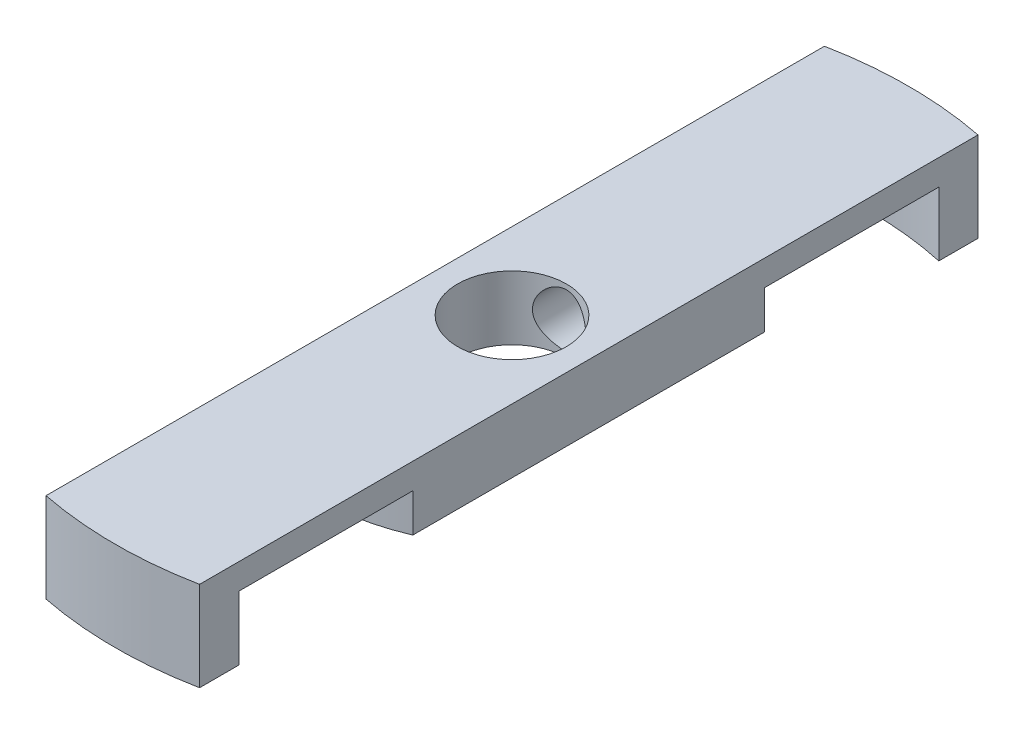
ISO-10303-21;
HEADER;
FILE_DESCRIPTION(('STEP AP214'),'2;1');
FILE_NAME('part.step','',(''),(''),'','','');
FILE_SCHEMA(('AUTOMOTIVE_DESIGN { 1 0 10303 214 1 1 1 1 }'));
ENDSEC;
DATA;
#1=APPLICATION_CONTEXT('core data for automotive mechanical design processes');
#2=APPLICATION_PROTOCOL_DEFINITION('international standard','automotive_design',2000,#1);
#3=PRODUCT_CONTEXT('',#1,'mechanical');
#4=PRODUCT('Part','Part','',(#3));
#5=PRODUCT_RELATED_PRODUCT_CATEGORY('part','',(#4));
#6=PRODUCT_DEFINITION_FORMATION('','',#4);
#7=PRODUCT_DEFINITION_CONTEXT('part definition',#1,'design');
#8=PRODUCT_DEFINITION('design','',#6,#7);
#9=PRODUCT_DEFINITION_SHAPE('','',#8);
#10=(LENGTH_UNIT() NAMED_UNIT(*) SI_UNIT(.MILLI.,.METRE.));
#11=(NAMED_UNIT(*) PLANE_ANGLE_UNIT() SI_UNIT($,.RADIAN.));
#12=(NAMED_UNIT(*) SI_UNIT($,.STERADIAN.) SOLID_ANGLE_UNIT());
#13=UNCERTAINTY_MEASURE_WITH_UNIT(LENGTH_MEASURE(1.E-05),#10,'distance_accuracy_value','');
#14=(GEOMETRIC_REPRESENTATION_CONTEXT(3) GLOBAL_UNCERTAINTY_ASSIGNED_CONTEXT((#13)) GLOBAL_UNIT_ASSIGNED_CONTEXT((#10,
#11,#12)) REPRESENTATION_CONTEXT('',''));
#15=CARTESIAN_POINT('',(0.,0.,0.));
#16=DIRECTION('',(0.,0.,1.));
#17=DIRECTION('',(1.,0.,0.));
#18=AXIS2_PLACEMENT_3D('',#15,#16,#17);
#19=CARTESIAN_POINT('',(4.25,5.,0.));
#20=DIRECTION('',(0.,1.,0.));
#21=DIRECTION('',(0.,0.,1.));
#22=AXIS2_PLACEMENT_3D('',#19,#20,#21);
#23=PLANE('',#22);
#24=CARTESIAN_POINT('',(0.,5.,0.));
#25=DIRECTION('',(0.,-1.,0.));
#26=DIRECTION('',(0.,0.,-1.));
#27=AXIS2_PLACEMENT_3D('',#24,#25,#26);
#28=CIRCLE('',#27,4.25);
#29=CARTESIAN_POINT('',(0.,5.,-4.25));
#30=VERTEX_POINT('',#29);
#31=EDGE_CURVE('E200',#30,#30,#28,.T.);
#32=ORIENTED_EDGE('',*,*,#31,.T.);
#33=EDGE_LOOP('',(#32));
#34=FACE_BOUND('',#33,.T.);
#35=CARTESIAN_POINT('',(0.,5.,0.));
#36=DIRECTION('',(0.,-1.,0.));
#37=DIRECTION('',(0.,0.,-1.));
#38=AXIS2_PLACEMENT_3D('',#35,#36,#37);
#39=CIRCLE('',#38,31.);
#40=CARTESIAN_POINT('',(6.,5.,30.4138126514911));
#41=VERTEX_POINT('',#40);
#42=CARTESIAN_POINT('',(-6.,5.,30.4138126514911));
#43=VERTEX_POINT('',#42);
#44=EDGE_CURVE('E162',#41,#43,#39,.T.);
#45=ORIENTED_EDGE('',*,*,#44,.F.);
#46=DIRECTION('',(0.,0.,-1.));
#47=VECTOR('',#46,1.);
#48=CARTESIAN_POINT('',(6.,5.,0.));
#49=LINE('',#48,#47);
#50=CARTESIAN_POINT('',(6.,5.,-30.4138126514911));
#51=VERTEX_POINT('',#50);
#52=EDGE_CURVE('E204',#41,#51,#49,.T.);
#53=ORIENTED_EDGE('',*,*,#52,.T.);
#54=CARTESIAN_POINT('',(-6.00000000000001,5.,-30.4138126514911));
#55=VERTEX_POINT('',#54);
#56=EDGE_CURVE('E156',#55,#51,#39,.T.);
#57=ORIENTED_EDGE('',*,*,#56,.F.);
#58=DIRECTION('',(0.,0.,1.));
#59=VECTOR('',#58,1.);
#60=CARTESIAN_POINT('',(-6.,5.,0.));
#61=LINE('',#60,#59);
#62=EDGE_CURVE('E131',#55,#43,#61,.T.);
#63=ORIENTED_EDGE('',*,*,#62,.T.);
#64=EDGE_LOOP('',(#45,#53,#57,#63));
#65=FACE_BOUND('',#64,.T.);
#66=ADVANCED_FACE('F33',(#34,#65),#23,.T.);
#67=CARTESIAN_POINT('',(0.,0.,0.));
#68=DIRECTION('',(0.,-1.,0.));
#69=DIRECTION('',(0.,0.,-1.));
#70=AXIS2_PLACEMENT_3D('',#67,#68,#69);
#71=CYLINDRICAL_SURFACE('',#70,31.);
#72=CARTESIAN_POINT('',(0.,-2.,0.));
#73=DIRECTION('',(0.,-1.,0.));
#74=DIRECTION('',(0.,0.,-1.));
#75=AXIS2_PLACEMENT_3D('',#72,#73,#74);
#76=CIRCLE('',#75,31.);
#77=CARTESIAN_POINT('',(6.,-2.,30.4138126514911));
#78=VERTEX_POINT('',#77);
#79=CARTESIAN_POINT('',(-6.,-2.,30.4138126514911));
#80=VERTEX_POINT('',#79);
#81=EDGE_CURVE('E152',#78,#80,#76,.T.);
#82=ORIENTED_EDGE('',*,*,#81,.F.);
#83=DIRECTION('',(0.,-1.,0.));
#84=VECTOR('',#83,1.);
#85=CARTESIAN_POINT('',(6.,0.,30.4138126514911));
#86=LINE('',#85,#84);
#87=EDGE_CURVE('E209',#78,#41,#86,.F.);
#88=ORIENTED_EDGE('',*,*,#87,.T.);
#89=ORIENTED_EDGE('',*,*,#44,.T.);
#90=DIRECTION('',(0.,-1.,0.));
#91=VECTOR('',#90,1.);
#92=CARTESIAN_POINT('',(-6.,0.,30.4138126514911));
#93=LINE('',#92,#91);
#94=EDGE_CURVE('E208',#43,#80,#93,.T.);
#95=ORIENTED_EDGE('',*,*,#94,.T.);
#96=EDGE_LOOP('',(#82,#88,#89,#95));
#97=FACE_BOUND('',#96,.T.);
#98=ADVANCED_FACE('F191',(#97),#71,.T.);
#99=ORIENTED_EDGE('',*,*,#56,.T.);
#100=DIRECTION('',(0.,-1.,0.));
#101=VECTOR('',#100,1.);
#102=CARTESIAN_POINT('',(6.,0.,-30.4138126514911));
#103=LINE('',#102,#101);
#104=CARTESIAN_POINT('',(6.,-2.,-30.4138126514911));
#105=VERTEX_POINT('',#104);
#106=EDGE_CURVE('E151',#51,#105,#103,.T.);
#107=ORIENTED_EDGE('',*,*,#106,.T.);
#108=CARTESIAN_POINT('',(-6.,-2.,-30.4138126514911));
#109=VERTEX_POINT('',#108);
#110=EDGE_CURVE('E143',#109,#105,#76,.T.);
#111=ORIENTED_EDGE('',*,*,#110,.F.);
#112=DIRECTION('',(0.,-1.,0.));
#113=VECTOR('',#112,1.);
#114=CARTESIAN_POINT('',(-6.,0.,-30.4138126514911));
#115=LINE('',#114,#113);
#116=EDGE_CURVE('E125',#109,#55,#115,.F.);
#117=ORIENTED_EDGE('',*,*,#116,.T.);
#118=EDGE_LOOP('',(#99,#107,#111,#117));
#119=FACE_BOUND('',#118,.T.);
#120=ADVANCED_FACE('F150',(#119),#71,.T.);
#121=CARTESIAN_POINT('',(31.,-2.,0.));
#122=DIRECTION('',(0.,-1.,0.));
#123=DIRECTION('',(0.,0.,-1.));
#124=AXIS2_PLACEMENT_3D('',#121,#122,#123);
#125=PLANE('',#124);
#126=ORIENTED_EDGE('',*,*,#110,.T.);
#127=DIRECTION('',(0.,0.,-1.));
#128=VECTOR('',#127,1.);
#129=CARTESIAN_POINT('',(6.,-2.,-38.1350597177935));
#130=LINE('',#129,#128);
#131=CARTESIAN_POINT('',(6.,-2.,-27.3495886623547));
#132=VERTEX_POINT('',#131);
#133=EDGE_CURVE('E277',#132,#105,#130,.T.);
#134=ORIENTED_EDGE('',*,*,#133,.F.);
#135=CARTESIAN_POINT('',(0.,-2.,0.));
#136=DIRECTION('',(0.,-1.,0.));
#137=DIRECTION('',(0.,0.,-1.));
#138=AXIS2_PLACEMENT_3D('',#135,#136,#137);
#139=CIRCLE('',#138,28.);
#140=CARTESIAN_POINT('',(-6.,-2.,-27.3495886623547));
#141=VERTEX_POINT('',#140);
#142=EDGE_CURVE('E145',#141,#132,#139,.T.);
#143=ORIENTED_EDGE('',*,*,#142,.F.);
#144=DIRECTION('',(0.,0.,1.));
#145=VECTOR('',#144,1.);
#146=CARTESIAN_POINT('',(-6.,-2.,-38.1350597177935));
#147=LINE('',#146,#145);
#148=EDGE_CURVE('E128',#109,#141,#147,.T.);
#149=ORIENTED_EDGE('',*,*,#148,.F.);
#150=EDGE_LOOP('',(#126,#134,#143,#149));
#151=FACE_BOUND('',#150,.T.);
#152=ADVANCED_FACE('F141',(#151),#125,.T.);
#153=CARTESIAN_POINT('',(6.,-2.,27.3495886623547));
#154=VERTEX_POINT('',#153);
#155=CARTESIAN_POINT('',(-6.,-2.,27.3495886623547));
#156=VERTEX_POINT('',#155);
#157=EDGE_CURVE('E153',#154,#156,#139,.T.);
#158=ORIENTED_EDGE('',*,*,#157,.F.);
#159=EDGE_CURVE('E276',#78,#154,#130,.T.);
#160=ORIENTED_EDGE('',*,*,#159,.F.);
#161=ORIENTED_EDGE('',*,*,#81,.T.);
#162=EDGE_CURVE('E147',#156,#80,#147,.T.);
#163=ORIENTED_EDGE('',*,*,#162,.F.);
#164=EDGE_LOOP('',(#158,#160,#161,#163));
#165=FACE_BOUND('',#164,.T.);
#166=ADVANCED_FACE('F275',(#165),#125,.T.);
#167=CARTESIAN_POINT('',(0.,0.,0.));
#168=DIRECTION('',(0.,-1.,0.));
#169=DIRECTION('',(0.,0.,-1.));
#170=AXIS2_PLACEMENT_3D('',#167,#168,#169);
#171=CYLINDRICAL_SURFACE('',#170,28.);
#172=CARTESIAN_POINT('',(0.,3.,0.));
#173=DIRECTION('',(0.,-1.,0.));
#174=DIRECTION('',(0.,0.,-1.));
#175=AXIS2_PLACEMENT_3D('',#172,#173,#174);
#176=CIRCLE('',#175,28.);
#177=CARTESIAN_POINT('',(6.,3.,27.3495886623547));
#178=VERTEX_POINT('',#177);
#179=CARTESIAN_POINT('',(-5.99999999999999,3.,27.3495886623547));
#180=VERTEX_POINT('',#179);
#181=EDGE_CURVE('E228',#178,#180,#176,.T.);
#182=ORIENTED_EDGE('',*,*,#181,.F.);
#183=DIRECTION('',(0.,-1.,0.));
#184=VECTOR('',#183,1.);
#185=CARTESIAN_POINT('',(6.,0.,27.3495886623547));
#186=LINE('',#185,#184);
#187=EDGE_CURVE('E268',#178,#154,#186,.T.);
#188=ORIENTED_EDGE('',*,*,#187,.T.);
#189=ORIENTED_EDGE('',*,*,#157,.T.);
#190=DIRECTION('',(0.,-1.,0.));
#191=VECTOR('',#190,1.);
#192=CARTESIAN_POINT('',(-6.,0.,27.3495886623547));
#193=LINE('',#192,#191);
#194=EDGE_CURVE('E249',#156,#180,#193,.F.);
#195=ORIENTED_EDGE('',*,*,#194,.T.);
#196=EDGE_LOOP('',(#182,#188,#189,#195));
#197=FACE_BOUND('',#196,.T.);
#198=ADVANCED_FACE('F272',(#197),#171,.F.);
#199=ORIENTED_EDGE('',*,*,#142,.T.);
#200=DIRECTION('',(0.,-1.,0.));
#201=VECTOR('',#200,1.);
#202=CARTESIAN_POINT('',(6.,0.,-27.3495886623547));
#203=LINE('',#202,#201);
#204=CARTESIAN_POINT('',(5.99999999999999,3.,-27.3495886623547));
#205=VERTEX_POINT('',#204);
#206=EDGE_CURVE('E265',#132,#205,#203,.F.);
#207=ORIENTED_EDGE('',*,*,#206,.T.);
#208=CARTESIAN_POINT('',(-6.,3.,-27.3495886623547));
#209=VERTEX_POINT('',#208);
#210=EDGE_CURVE('E226',#209,#205,#176,.T.);
#211=ORIENTED_EDGE('',*,*,#210,.F.);
#212=DIRECTION('',(0.,-1.,0.));
#213=VECTOR('',#212,1.);
#214=CARTESIAN_POINT('',(-6.,0.,-27.3495886623547));
#215=LINE('',#214,#213);
#216=EDGE_CURVE('E252',#209,#141,#215,.T.);
#217=ORIENTED_EDGE('',*,*,#216,.T.);
#218=EDGE_LOOP('',(#199,#207,#211,#217));
#219=FACE_BOUND('',#218,.T.);
#220=ADVANCED_FACE('F286',(#219),#171,.F.);
#221=CARTESIAN_POINT('',(28.,3.,0.));
#222=DIRECTION('',(0.,-1.,0.));
#223=DIRECTION('',(0.,0.,-1.));
#224=AXIS2_PLACEMENT_3D('',#221,#222,#223);
#225=PLANE('',#224);
#226=ORIENTED_EDGE('',*,*,#210,.T.);
#227=DIRECTION('',(0.,0.,1.));
#228=VECTOR('',#227,1.);
#229=CARTESIAN_POINT('',(6.,3.,0.));
#230=LINE('',#229,#228);
#231=CARTESIAN_POINT('',(6.,3.,-13.7477270848675));
#232=VERTEX_POINT('',#231);
#233=EDGE_CURVE('E264',#205,#232,#230,.T.);
#234=ORIENTED_EDGE('',*,*,#233,.T.);
#235=CARTESIAN_POINT('',(0.,3.,0.));
#236=DIRECTION('',(0.,-1.,0.));
#237=DIRECTION('',(0.,0.,-1.));
#238=AXIS2_PLACEMENT_3D('',#235,#236,#237);
#239=CIRCLE('',#238,15.);
#240=CARTESIAN_POINT('',(-6.,3.,-13.7477270848675));
#241=VERTEX_POINT('',#240);
#242=EDGE_CURVE('E223',#241,#232,#239,.T.);
#243=ORIENTED_EDGE('',*,*,#242,.F.);
#244=DIRECTION('',(0.,0.,-1.));
#245=VECTOR('',#244,1.);
#246=CARTESIAN_POINT('',(-5.99999999999999,3.,0.));
#247=LINE('',#246,#245);
#248=EDGE_CURVE('E250',#241,#209,#247,.T.);
#249=ORIENTED_EDGE('',*,*,#248,.T.);
#250=EDGE_LOOP('',(#226,#234,#243,#249));
#251=FACE_BOUND('',#250,.T.);
#252=ADVANCED_FACE('F284',(#251),#225,.T.);
#253=CARTESIAN_POINT('',(6.,3.,13.7477270848675));
#254=VERTEX_POINT('',#253);
#255=CARTESIAN_POINT('',(-6.,3.,13.7477270848675));
#256=VERTEX_POINT('',#255);
#257=EDGE_CURVE('E225',#254,#256,#239,.T.);
#258=ORIENTED_EDGE('',*,*,#257,.F.);
#259=EDGE_CURVE('E245',#254,#178,#230,.T.);
#260=ORIENTED_EDGE('',*,*,#259,.T.);
#261=ORIENTED_EDGE('',*,*,#181,.T.);
#262=EDGE_CURVE('E247',#180,#256,#247,.T.);
#263=ORIENTED_EDGE('',*,*,#262,.T.);
#264=EDGE_LOOP('',(#258,#260,#261,#263));
#265=FACE_BOUND('',#264,.T.);
#266=ADVANCED_FACE('F244',(#265),#225,.T.);
#267=CARTESIAN_POINT('',(0.,0.,0.));
#268=DIRECTION('',(0.,-1.,0.));
#269=DIRECTION('',(0.,0.,-1.));
#270=AXIS2_PLACEMENT_3D('',#267,#268,#269);
#271=CYLINDRICAL_SURFACE('',#270,15.);
#272=CARTESIAN_POINT('',(0.,0.,0.));
#273=DIRECTION('',(0.,-1.,0.));
#274=DIRECTION('',(0.,0.,-1.));
#275=AXIS2_PLACEMENT_3D('',#272,#273,#274);
#276=CIRCLE('',#275,15.);
#277=CARTESIAN_POINT('',(6.,0.,13.7477270848675));
#278=VERTEX_POINT('',#277);
#279=CARTESIAN_POINT('',(-6.,0.,13.7477270848675));
#280=VERTEX_POINT('',#279);
#281=EDGE_CURVE('E222',#278,#280,#276,.T.);
#282=ORIENTED_EDGE('',*,*,#281,.F.);
#283=DIRECTION('',(0.,-1.,0.));
#284=VECTOR('',#283,1.);
#285=CARTESIAN_POINT('',(6.,0.,13.7477270848675));
#286=LINE('',#285,#284);
#287=EDGE_CURVE('E62',#278,#254,#286,.F.);
#288=ORIENTED_EDGE('',*,*,#287,.T.);
#289=ORIENTED_EDGE('',*,*,#257,.T.);
#290=DIRECTION('',(0.,-1.,0.));
#291=VECTOR('',#290,1.);
#292=CARTESIAN_POINT('',(-6.,0.,13.7477270848675));
#293=LINE('',#292,#291);
#294=EDGE_CURVE('E146',#256,#280,#293,.T.);
#295=ORIENTED_EDGE('',*,*,#294,.T.);
#296=EDGE_LOOP('',(#282,#288,#289,#295));
#297=FACE_BOUND('',#296,.T.);
#298=ADVANCED_FACE('F239',(#297),#271,.T.);
#299=ORIENTED_EDGE('',*,*,#242,.T.);
#300=DIRECTION('',(0.,-1.,0.));
#301=VECTOR('',#300,1.);
#302=CARTESIAN_POINT('',(6.,0.,-13.7477270848675));
#303=LINE('',#302,#301);
#304=CARTESIAN_POINT('',(6.,0.,-13.7477270848675));
#305=VERTEX_POINT('',#304);
#306=EDGE_CURVE('E136',#232,#305,#303,.T.);
#307=ORIENTED_EDGE('',*,*,#306,.T.);
#308=CARTESIAN_POINT('',(-6.,0.,-13.7477270848675));
#309=VERTEX_POINT('',#308);
#310=EDGE_CURVE('E219',#309,#305,#276,.T.);
#311=ORIENTED_EDGE('',*,*,#310,.F.);
#312=DIRECTION('',(0.,-1.,0.));
#313=VECTOR('',#312,1.);
#314=CARTESIAN_POINT('',(-6.,0.,-13.7477270848675));
#315=LINE('',#314,#313);
#316=EDGE_CURVE('E54',#309,#241,#315,.F.);
#317=ORIENTED_EDGE('',*,*,#316,.T.);
#318=EDGE_LOOP('',(#299,#307,#311,#317));
#319=FACE_BOUND('',#318,.T.);
#320=ADVANCED_FACE('F283',(#319),#271,.T.);
#321=CARTESIAN_POINT('',(15.,0.,0.));
#322=DIRECTION('',(0.,-1.,0.));
#323=DIRECTION('',(0.,0.,-1.));
#324=AXIS2_PLACEMENT_3D('',#321,#322,#323);
#325=PLANE('',#324);
#326=CARTESIAN_POINT('',(0.,0.,0.));
#327=DIRECTION('',(0.,-1.,0.));
#328=DIRECTION('',(0.,0.,-1.));
#329=AXIS2_PLACEMENT_3D('',#326,#327,#328);
#330=CIRCLE('',#329,4.25);
#331=CARTESIAN_POINT('',(0.,0.,-4.25));
#332=VERTEX_POINT('',#331);
#333=EDGE_CURVE('E212',#332,#332,#330,.T.);
#334=ORIENTED_EDGE('',*,*,#333,.F.);
#335=EDGE_LOOP('',(#334));
#336=FACE_BOUND('',#335,.T.);
#337=ORIENTED_EDGE('',*,*,#310,.T.);
#338=DIRECTION('',(0.,0.,1.));
#339=VECTOR('',#338,1.);
#340=CARTESIAN_POINT('',(6.,0.,0.));
#341=LINE('',#340,#339);
#342=EDGE_CURVE('E11',#305,#278,#341,.T.);
#343=ORIENTED_EDGE('',*,*,#342,.T.);
#344=ORIENTED_EDGE('',*,*,#281,.T.);
#345=DIRECTION('',(0.,0.,-1.));
#346=VECTOR('',#345,1.);
#347=CARTESIAN_POINT('',(-6.,0.,0.));
#348=LINE('',#347,#346);
#349=EDGE_CURVE('E46',#280,#309,#348,.T.);
#350=ORIENTED_EDGE('',*,*,#349,.T.);
#351=EDGE_LOOP('',(#337,#343,#344,#350));
#352=FACE_BOUND('',#351,.T.);
#353=ADVANCED_FACE('F368',(#336,#352),#325,.T.);
#354=CARTESIAN_POINT('',(0.,0.,0.));
#355=DIRECTION('',(0.,-1.,0.));
#356=DIRECTION('',(0.,0.,-1.));
#357=AXIS2_PLACEMENT_3D('',#354,#355,#356);
#358=CYLINDRICAL_SURFACE('',#357,4.25);
#359=CARTESIAN_POINT('',(0.,4.6,-4.25));
#360=CARTESIAN_POINT('',(-0.110556303358754,4.59999317399498,-4.24999410772435));
#361=CARTESIAN_POINT('',(-0.221249036358152,4.5912181636214,-4.2456396033572));
#362=CARTESIAN_POINT('',(-0.439372728289568,4.55650157612348,-4.22864969313588));
#363=CARTESIAN_POINT('',(-0.546796870279314,4.53052639259913,-4.21599807651122));
#364=CARTESIAN_POINT('',(-0.754893232206413,4.4626682008808,-4.18374019464092));
#365=CARTESIAN_POINT('',(-0.85558974506378,4.4208465247321,-4.16416076181367));
#366=CARTESIAN_POINT('',(-1.04839235535412,4.32279503917431,-4.11985107782541));
#367=CARTESIAN_POINT('',(-1.14049926128841,4.26656658768138,-4.0951213121521));
#368=CARTESIAN_POINT('',(-1.31967279343061,4.1374889715676,-4.04106838263261));
#369=CARTESIAN_POINT('',(-1.40611363338117,4.06385005636738,-4.01155948094398));
#370=CARTESIAN_POINT('',(-1.56599238758369,3.9037391703026,-3.95189365333118));
#371=CARTESIAN_POINT('',(-1.63942064176534,3.81725775243917,-3.92173626446217));
#372=CARTESIAN_POINT('',(-1.77672701951696,3.62610205040073,-3.86157698249635));
#373=CARTESIAN_POINT('',(-1.83947014763541,3.52054831980224,-3.8317576852663));
#374=CARTESIAN_POINT('',(-1.94604792933965,3.2987517998702,-3.77875168390664));
#375=CARTESIAN_POINT('',(-1.98989585339625,3.18251658219032,-3.75556032871186));
#376=CARTESIAN_POINT('',(-2.05462572634006,2.94969401669414,-3.72052473890271));
#377=CARTESIAN_POINT('',(-2.07671431515265,2.83353545384375,-3.70808968108121));
#378=CARTESIAN_POINT('',(-2.10100060814591,2.59855027364744,-3.69438949659645));
#379=CARTESIAN_POINT('',(-2.1032171528909,2.47972629057056,-3.69311378984809));
#380=CARTESIAN_POINT('',(-2.08858300285649,2.25760830025496,-3.70139904057675));
#381=CARTESIAN_POINT('',(-2.07391623247153,2.15411297810724,-3.70971900279345));
#382=CARTESIAN_POINT('',(-2.02970634826807,1.95130235992585,-3.73408927918684));
#383=CARTESIAN_POINT('',(-2.00015867776722,1.85198835435348,-3.75014196113508));
#384=CARTESIAN_POINT('',(-1.92647747338611,1.65753027833043,-3.78852694172324));
#385=CARTESIAN_POINT('',(-1.88201985439027,1.56253746758938,-3.8109969560182));
#386=CARTESIAN_POINT('',(-1.78002709499898,1.38090906846136,-3.85968828961008));
#387=CARTESIAN_POINT('',(-1.7224860931186,1.29427725073754,-3.88591128832391));
#388=CARTESIAN_POINT('',(-1.58767280279827,1.1205707752944,-3.94306809408518));
#389=CARTESIAN_POINT('',(-1.50884162369175,1.0347616434587,-3.97418382003245));
#390=CARTESIAN_POINT('',(-1.33776426389453,0.877061722174146,-4.03498810518282));
#391=CARTESIAN_POINT('',(-1.24551199008394,0.805177289224744,-4.06467600797091));
#392=CARTESIAN_POINT('',(-1.04501442194768,0.674380317930652,-4.12089102765802));
#393=CARTESIAN_POINT('',(-0.93624114022342,0.616184845950098,-4.14721945857502));
#394=CARTESIAN_POINT('',(-0.708816842127959,0.519389675354476,-4.1920721360433));
#395=CARTESIAN_POINT('',(-0.590173579354789,0.480774760857918,-4.21060244054052));
#396=CARTESIAN_POINT('',(-0.356749311425299,0.427350372904003,-4.23649382228912));
#397=CARTESIAN_POINT('',(-0.242441815606426,0.410856991237936,-4.24464222716034));
#398=CARTESIAN_POINT('',(-0.0124076012942767,0.396882068740116,-4.25153643122759));
#399=CARTESIAN_POINT('',(0.103318443912777,0.399391832613371,-4.2502865308207));
#400=CARTESIAN_POINT('',(0.323645377568967,0.422358005009546,-4.23898741496441));
#401=CARTESIAN_POINT('',(0.428427830088523,0.441448849615887,-4.22960785094664));
#402=CARTESIAN_POINT('',(0.63309814883376,0.494912067361673,-4.20384711116735));
#403=CARTESIAN_POINT('',(0.732985468338008,0.529286143136475,-4.187465155309));
#404=CARTESIAN_POINT('',(0.928383736098421,0.613271439984488,-4.14859272633651));
#405=CARTESIAN_POINT('',(1.0236830804983,0.663296519465617,-4.12593853688364));
#406=CARTESIAN_POINT('',(1.20485501400329,0.776700956432174,-4.07672066447704));
#407=CARTESIAN_POINT('',(1.29072352479109,0.840086057075043,-4.05015530168777));
#408=CARTESIAN_POINT('',(1.45937102404196,0.98547151744999,-3.99267049363664));
#409=CARTESIAN_POINT('',(1.54105377811859,1.06867749346345,-3.96157820256396));
#410=CARTESIAN_POINT('',(1.68977840302567,1.24771981059694,-3.90046500905869));
#411=CARTESIAN_POINT('',(1.75681073044846,1.34356431978057,-3.8704448155864));
#412=CARTESIAN_POINT('',(1.8771744235944,1.55068659216204,-3.8135750593287));
#413=CARTESIAN_POINT('',(1.92974592351382,1.66246736459493,-3.78693122358612));
#414=CARTESIAN_POINT('',(2.01476877575863,1.89503345264799,-3.74239834110081));
#415=CARTESIAN_POINT('',(2.04724544760706,2.01580722110663,-3.72449828319595));
#416=CARTESIAN_POINT('',(2.08821208466037,2.25061763413962,-3.70167136082873));
#417=CARTESIAN_POINT('',(2.09869132804838,2.36420100136009,-3.69567163372635));
#418=CARTESIAN_POINT('',(2.10107617115825,2.59160664540293,-3.69431841676633));
#419=CARTESIAN_POINT('',(2.09298921622539,2.70542880817601,-3.69896065930595));
#420=CARTESIAN_POINT('',(2.06031975915656,2.9191721421235,-3.71724005716886));
#421=CARTESIAN_POINT('',(2.03730586120513,3.01941553679358,-3.7300199365678));
#422=CARTESIAN_POINT('',(1.97734260749327,3.21452031107656,-3.76214915317579));
#423=CARTESIAN_POINT('',(1.94038884683751,3.30937997855901,-3.78150056674885));
#424=CARTESIAN_POINT('',(1.85080461902624,3.49807650629849,-3.82618379354443));
#425=CARTESIAN_POINT('',(1.79728696926069,3.59141550990125,-3.85183028637351));
#426=CARTESIAN_POINT('',(1.67709119176069,3.76839304280751,-3.9056626328837));
#427=CARTESIAN_POINT('',(1.61040631200418,3.85202656015495,-3.93384978534187));
#428=CARTESIAN_POINT('',(1.45656351442929,4.01744245420699,-3.99355696582289));
#429=CARTESIAN_POINT('',(1.36792010242959,4.09785005216557,-4.02507904903987));
#430=CARTESIAN_POINT('',(1.17749087845089,4.24294071244627,-4.08484591677569));
#431=CARTESIAN_POINT('',(1.07569821448681,4.30761552550326,-4.11308897794589));
#432=CARTESIAN_POINT('',(0.860781430076318,4.41931979536521,-4.16338652853686));
#433=CARTESIAN_POINT('',(0.747607820729623,4.46626756003656,-4.18541225162924));
#434=CARTESIAN_POINT('',(0.513710050061943,4.53986244894963,-4.22048316405331));
#435=CARTESIAN_POINT('',(0.393008632559218,4.56656779496561,-4.23355409887157));
#436=CARTESIAN_POINT('',(0.225925588147404,4.58830463137369,-4.24423155690694));
#437=CARTESIAN_POINT('',(0.180887268849516,4.59268447879579,-4.24638934045657));
#438=CARTESIAN_POINT('',(0.0905736051996942,4.59853360116907,-4.24927478860683));
#439=CARTESIAN_POINT('',(0.0452982544235928,4.60000279682029,-4.25000241424318));
#440=CARTESIAN_POINT('',(0.,4.6,-4.25));
#441=B_SPLINE_CURVE_WITH_KNOTS('',3,(#359,#360,#361,#362,#363,#364,#365,#366,#367,#368,#369,
#370,#371,#372,#373,#374,#375,#376,#377,#378,#379,#380,#381,#382,#383,#384,#385,#386,#387,#388,
#389,#390,#391,#392,#393,#394,#395,#396,#397,#398,#399,#400,#401,#402,#403,#404,#405,#406,#407,
#408,#409,#410,#411,#412,#413,#414,#415,#416,#417,#418,#419,#420,#421,#422,#423,#424,#425,#426,
#427,#428,#429,#430,#431,#432,#433,#434,#435,#436,#437,#438,#439,#440),.UNSPECIFIED.,.T.,.F.,(4,
2,2,2,2,2,2,2,2,2,2,2,2,2,2,2,2,2,2,2,2,2,2,2,2,2,2,2,2,2,2,2,2,2,2,2,2,2,2,2,4),(0.,
0.331484886424099,0.663619360153381,0.9944812629316,1.3253119916585,1.67582318164309,
2.02659349819325,2.4037687478049,2.78067866642631,3.13526013438059,3.48950539020604,
3.80262095487295,4.11583245704656,4.43634832337423,4.75700806790449,5.11725224791609,
5.47766049060292,5.8540597628056,6.23016608841344,6.57561427828733,6.92090441052155,
7.24019511934137,7.55952140780492,7.88812961705787,8.21687937637365,8.5773278377442,
8.93801040296222,9.31506208314773,9.69163770482406,10.032361612141,10.3729489075377,
10.6825324980873,10.9922139968607,11.3227230166198,11.6534019602708,12.0229757094665,
12.3927428237964,12.7641937337793,13.1345721699578,13.2703878329719,13.406207196198),.UNSPECIFIED.);
#442=CARTESIAN_POINT('',(0.,4.6,-4.25));
#443=VERTEX_POINT('',#442);
#444=EDGE_CURVE('E36',#443,#443,#441,.T.);
#445=ORIENTED_EDGE('',*,*,#444,.F.);
#446=EDGE_LOOP('',(#445));
#447=FACE_BOUND('',#446,.T.);
#448=CARTESIAN_POINT('',(2.1,2.5,3.69492895736846));
#449=CARTESIAN_POINT('',(2.09999138350079,2.39037721042204,3.69493932406185));
#450=CARTESIAN_POINT('',(2.09135858343032,2.28060722518447,3.69988181886155));
#451=CARTESIAN_POINT('',(2.05725736460397,2.0644226061151,3.71894461177438));
#452=CARTESIAN_POINT('',(2.03175273827106,1.95801570529909,3.73308464706367));
#453=CARTESIAN_POINT('',(1.96526698949882,1.75208755578362,3.7685040833117));
#454=CARTESIAN_POINT('',(1.92436662650125,1.65253352878999,3.78974616606504));
#455=CARTESIAN_POINT('',(1.8284962468938,1.46172517018659,3.83691891461697));
#456=CARTESIAN_POINT('',(1.7735257552304,1.37047111895217,3.86284973871412));
#457=CARTESIAN_POINT('',(1.64588818496162,1.19074216538902,3.91902895505268));
#458=CARTESIAN_POINT('',(1.5721532384593,1.10308137671202,3.94945686541071));
#459=CARTESIAN_POINT('',(1.41130209839335,0.94073962681258,4.00975127708351));
#460=CARTESIAN_POINT('',(1.32417940092626,0.86606501219365,4.03961749756575));
#461=CARTESIAN_POINT('',(1.13205470431028,0.727034781147255,4.09776245071044));
#462=CARTESIAN_POINT('',(1.02625569918907,0.663674468552826,4.12580933292015));
#463=CARTESIAN_POINT('',(0.803855231995372,0.55602210295501,4.17483486031805));
#464=CARTESIAN_POINT('',(0.687260485143756,0.511718291884775,4.19581786225427));
#465=CARTESIAN_POINT('',(0.455198283463956,0.446640469455955,4.22705928169069));
#466=CARTESIAN_POINT('',(0.340219621300446,0.424440588469648,4.23796374833108));
#467=CARTESIAN_POINT('',(0.107691841876518,0.399511597552563,4.25022659798389));
#468=CARTESIAN_POINT('',(-0.00985572067911298,0.396771021159564,4.25159060273925));
#469=CARTESIAN_POINT('',(-0.233491307471508,0.41027321751312,4.2449307871078));
#470=CARTESIAN_POINT('',(-0.339704327655618,0.424922676391057,4.23769484446135));
#471=CARTESIAN_POINT('',(-0.547934974139022,0.469946817718276,4.21583083842359));
#472=CARTESIAN_POINT('',(-0.649952286461667,0.500322674715387,4.20120222290221));
#473=CARTESIAN_POINT('',(-0.848697286613601,0.576151885399658,4.1656401778139));
#474=CARTESIAN_POINT('',(-0.945330275664164,0.621811501890708,4.14462087920611));
#475=CARTESIAN_POINT('',(-1.12979978752471,0.726636057176485,4.09818417920664));
#476=CARTESIAN_POINT('',(-1.21763312199546,0.785805865778889,4.07276519272956));
#477=CARTESIAN_POINT('',(-1.39071248241957,0.922290596327881,4.01714198051385));
#478=CARTESIAN_POINT('',(-1.47496048293705,1.00078039839447,3.98671258356451));
#479=CARTESIAN_POINT('',(-1.62962910084967,1.17052316451465,3.92603179182575));
#480=CARTESIAN_POINT('',(-1.70003951074443,1.26178546605747,3.89578054428846));
#481=CARTESIAN_POINT('',(-1.82922677228564,1.46130261680592,3.83689672542808));
#482=CARTESIAN_POINT('',(-1.88703351482246,1.57025397905704,3.80847505530829));
#483=CARTESIAN_POINT('',(-1.98306236739155,1.79807266712487,3.7593752208293));
#484=CARTESIAN_POINT('',(-2.02130451501382,1.91692970207181,3.73868913973244));
#485=CARTESIAN_POINT('',(-2.07405593638656,2.15134062100989,3.70966817727699));
#486=CARTESIAN_POINT('',(-2.09019463618338,2.26641959505688,3.70049014531109));
#487=CARTESIAN_POINT('',(-2.1031921547007,2.497980636463,3.69312244949645));
#488=CARTESIAN_POINT('',(-2.1000638764936,2.61446171267313,3.69492543166653));
#489=CARTESIAN_POINT('',(-2.07611179210531,2.83241684850094,3.70842285198009));
#490=CARTESIAN_POINT('',(-2.0571915623402,2.93417670360459,3.7190526219878));
#491=CARTESIAN_POINT('',(-2.00499537201494,3.13289279442364,3.74744838682104));
#492=CARTESIAN_POINT('',(-1.97171489629561,3.22984750860494,3.76521662600814));
#493=CARTESIAN_POINT('',(-1.89011067560279,3.42131152718698,3.80685749449373));
#494=CARTESIAN_POINT('',(-1.84116047288888,3.51549852771386,3.83097515104304));
#495=CARTESIAN_POINT('',(-1.73015688807824,3.69486169605312,3.88236992780571));
#496=CARTESIAN_POINT('',(-1.66809679969699,3.78003321844995,3.90964866181306));
#497=CARTESIAN_POINT('',(-1.52374246371504,3.94986175325748,3.96831049648386));
#498=CARTESIAN_POINT('',(-1.43990071582709,4.03317718656808,3.99978697670245));
#499=CARTESIAN_POINT('',(-1.25890797768609,4.18496383527201,4.06038868143827));
#500=CARTESIAN_POINT('',(-1.16175283739329,4.25343040473442,4.0895131682771));
#501=CARTESIAN_POINT('',(-0.953645484749725,4.37494354872623,4.14304995984921));
#502=CARTESIAN_POINT('',(-0.842417320562355,4.42757900005699,4.16733187169405));
#503=CARTESIAN_POINT('',(-0.611141010525493,4.51287379526238,4.2074617530969));
#504=CARTESIAN_POINT('',(-0.491100529315334,4.54555027346092,4.22331695527014));
#505=CARTESIAN_POINT('',(-0.257318841948664,4.58724457139471,4.24367714177183));
#506=CARTESIAN_POINT('',(-0.143988617265931,4.5981334577347,4.2490783092851));
#507=CARTESIAN_POINT('',(0.0829897424091301,4.60142356001508,4.25070281427146));
#508=CARTESIAN_POINT('',(0.196637758724786,4.5938309426715,4.2469292130865));
#509=CARTESIAN_POINT('',(0.413450340672309,4.56162835412116,4.23115074853377));
#510=CARTESIAN_POINT('',(0.516822810635299,4.53812748799203,4.21968276323281));
#511=CARTESIAN_POINT('',(0.717999038123386,4.47624855363445,4.19014571328257));
#512=CARTESIAN_POINT('',(0.815801976502896,4.43786830345063,4.17207568051259));
#513=CARTESIAN_POINT('',(1.00782248477436,4.34557122625956,4.12999706065305));
#514=CARTESIAN_POINT('',(1.10170023958591,4.29105241101911,4.10576477905284));
#515=CARTESIAN_POINT('',(1.27936900625924,4.16878996388413,4.05392328246504));
#516=CARTESIAN_POINT('',(1.36315534538174,4.10104024330977,4.02631251493781));
#517=CARTESIAN_POINT('',(1.52686324768882,3.94656548489673,3.96730103708566));
#518=CARTESIAN_POINT('',(1.60561259583013,3.85863471194451,3.9357931958955));
#519=CARTESIAN_POINT('',(1.74764804799904,3.67032616018142,3.87481773235394));
#520=CARTESIAN_POINT('',(1.81092101414066,3.56993791443723,3.84535185852723));
#521=CARTESIAN_POINT('',(1.92167532532192,3.35560949806553,3.79125269144922));
#522=CARTESIAN_POINT('',(1.96866342092276,3.24136797244697,3.76677830731012));
#523=CARTESIAN_POINT('',(2.0237025930155,3.06431847085786,3.73731851159035));
#524=CARTESIAN_POINT('',(2.03946781498887,3.00441115602264,3.72871175116768));
#525=CARTESIAN_POINT('',(2.06568323637592,2.88313312945415,3.71425370917222));
#526=CARTESIAN_POINT('',(2.07613718272811,2.82176348143823,3.70840048528221));
#527=CARTESIAN_POINT('',(2.08921723635361,2.7169191689989,3.70104151012709));
#528=CARTESIAN_POINT('',(2.09325638650264,2.67366928470427,3.69875533113382));
#529=CARTESIAN_POINT('',(2.0986495648524,2.58695399804066,3.69569694918588));
#530=CARTESIAN_POINT('',(2.10000341826123,2.54348858182681,3.69492484478571));
#531=CARTESIAN_POINT('',(2.1,2.5,3.69492895736846));
#532=B_SPLINE_CURVE_WITH_KNOTS('',3,(#448,#449,#450,#451,#452,#453,#454,#455,#456,#457,#458,
#459,#460,#461,#462,#463,#464,#465,#466,#467,#468,#469,#470,#471,#472,#473,#474,#475,#476,#477,
#478,#479,#480,#481,#482,#483,#484,#485,#486,#487,#488,#489,#490,#491,#492,#493,#494,#495,#496,
#497,#498,#499,#500,#501,#502,#503,#504,#505,#506,#507,#508,#509,#510,#511,#512,#513,#514,#515,
#516,#517,#518,#519,#520,#521,#522,#523,#524,#525,#526,#527,#528,#529,#530,#531),.UNSPECIFIED.,
.T.,.F.,(4,2,2,2,2,2,2,2,2,2,2,2,2,2,2,2,2,2,2,2,2,2,2,2,2,2,2,2,2,2,2,2,2,2,2,2,2,2,2,2,2,4),
(0.,0.328692861111083,0.658093407863806,0.985789609296072,1.31349687628279,1.66756662438676,
2.0218089301245,2.39923712758491,2.77643211255487,3.12731324879097,3.47798760993815,
3.79886355370593,4.11976346599593,4.44518150362494,4.77071702529915,5.12648837037166,
5.48252117833418,5.86024495569177,6.23758109902285,6.5852526461017,6.93269138328515,
7.24343975501139,7.55428590374901,7.87955795510381,8.20499680213592,8.57030870286876,
8.93573473847187,9.30996237325349,9.68386828893413,10.0239865629283,10.36399136535,
10.682445803717,11.000946958827,11.3332708632136,11.6657480603786,12.0306237683757,
12.3958081523158,12.7712456082728,12.9586238517762,13.1458697216085,13.2762573543189,
13.4066534739702),.UNSPECIFIED.);
#533=CARTESIAN_POINT('',(2.1,2.5,3.69492895736846));
#534=VERTEX_POINT('',#533);
#535=EDGE_CURVE('E163',#534,#534,#532,.T.);
#536=ORIENTED_EDGE('',*,*,#535,.F.);
#537=EDGE_LOOP('',(#536));
#538=FACE_BOUND('',#537,.T.);
#539=ORIENTED_EDGE('',*,*,#333,.T.);
#540=EDGE_LOOP('',(#539));
#541=FACE_BOUND('',#540,.T.);
#542=ORIENTED_EDGE('',*,*,#31,.F.);
#543=EDGE_LOOP('',(#542));
#544=FACE_BOUND('',#543,.T.);
#545=ADVANCED_FACE('F169',(#447,#538,#541,#544),#358,.F.);
#546=CARTESIAN_POINT('',(-6.,-2.,-38.1350597177935));
#547=DIRECTION('',(-1.,0.,0.));
#548=DIRECTION('',(0.,0.,1.));
#549=AXIS2_PLACEMENT_3D('',#546,#547,#548);
#550=PLANE('',#549);
#551=ORIENTED_EDGE('',*,*,#148,.T.);
#552=ORIENTED_EDGE('',*,*,#216,.F.);
#553=ORIENTED_EDGE('',*,*,#248,.F.);
#554=ORIENTED_EDGE('',*,*,#316,.F.);
#555=ORIENTED_EDGE('',*,*,#349,.F.);
#556=ORIENTED_EDGE('',*,*,#294,.F.);
#557=ORIENTED_EDGE('',*,*,#262,.F.);
#558=ORIENTED_EDGE('',*,*,#194,.F.);
#559=ORIENTED_EDGE('',*,*,#162,.T.);
#560=ORIENTED_EDGE('',*,*,#94,.F.);
#561=ORIENTED_EDGE('',*,*,#62,.F.);
#562=ORIENTED_EDGE('',*,*,#116,.F.);
#563=EDGE_LOOP('',(#551,#552,#553,#554,#555,#556,#557,#558,#559,#560,#561,#562));
#564=FACE_BOUND('',#563,.T.);
#565=ADVANCED_FACE('F127',(#564),#550,.T.);
#566=CARTESIAN_POINT('',(6.,-2.,-38.1350597177935));
#567=DIRECTION('',(1.,0.,0.));
#568=DIRECTION('',(0.,0.,-1.));
#569=AXIS2_PLACEMENT_3D('',#566,#567,#568);
#570=PLANE('',#569);
#571=ORIENTED_EDGE('',*,*,#159,.T.);
#572=ORIENTED_EDGE('',*,*,#187,.F.);
#573=ORIENTED_EDGE('',*,*,#259,.F.);
#574=ORIENTED_EDGE('',*,*,#287,.F.);
#575=ORIENTED_EDGE('',*,*,#342,.F.);
#576=ORIENTED_EDGE('',*,*,#306,.F.);
#577=ORIENTED_EDGE('',*,*,#233,.F.);
#578=ORIENTED_EDGE('',*,*,#206,.F.);
#579=ORIENTED_EDGE('',*,*,#133,.T.);
#580=ORIENTED_EDGE('',*,*,#106,.F.);
#581=ORIENTED_EDGE('',*,*,#52,.F.);
#582=ORIENTED_EDGE('',*,*,#87,.F.);
#583=EDGE_LOOP('',(#571,#572,#573,#574,#575,#576,#577,#578,#579,#580,#581,#582));
#584=FACE_BOUND('',#583,.T.);
#585=ADVANCED_FACE('F184',(#584),#570,.T.);
#586=CARTESIAN_POINT('',(0.,2.5,13.));
#587=DIRECTION('',(0.,0.,1.));
#588=DIRECTION('',(1.,0.,0.));
#589=AXIS2_PLACEMENT_3D('',#586,#587,#588);
#590=PLANE('',#589);
#591=CARTESIAN_POINT('',(0.,2.5,13.));
#592=DIRECTION('',(0.,0.,1.));
#593=DIRECTION('',(1.,0.,0.));
#594=AXIS2_PLACEMENT_3D('',#591,#592,#593);
#595=CIRCLE('',#594,2.1);
#596=CARTESIAN_POINT('',(2.1,2.5,13.));
#597=VERTEX_POINT('',#596);
#598=EDGE_CURVE('E358',#597,#597,#595,.T.);
#599=ORIENTED_EDGE('',*,*,#598,.F.);
#600=EDGE_LOOP('',(#599));
#601=FACE_BOUND('',#600,.T.);
#602=ADVANCED_FACE('F179',(#601),#590,.F.);
#603=CARTESIAN_POINT('',(0.,2.5,-13.));
#604=DIRECTION('',(0.,0.,1.));
#605=DIRECTION('',(1.,0.,0.));
#606=AXIS2_PLACEMENT_3D('',#603,#604,#605);
#607=CYLINDRICAL_SURFACE('',#606,2.1);
#608=ORIENTED_EDGE('',*,*,#535,.T.);
#609=EDGE_LOOP('',(#608));
#610=FACE_BOUND('',#609,.T.);
#611=ORIENTED_EDGE('',*,*,#598,.T.);
#612=EDGE_LOOP('',(#611));
#613=FACE_BOUND('',#612,.T.);
#614=ADVANCED_FACE('F173',(#610,#613),#607,.F.);
#615=ORIENTED_EDGE('',*,*,#444,.T.);
#616=EDGE_LOOP('',(#615));
#617=FACE_BOUND('',#616,.T.);
#618=CARTESIAN_POINT('',(0.,2.5,-13.));
#619=DIRECTION('',(0.,0.,1.));
#620=DIRECTION('',(1.,0.,0.));
#621=AXIS2_PLACEMENT_3D('',#618,#619,#620);
#622=CIRCLE('',#621,2.1);
#623=CARTESIAN_POINT('',(2.1,2.5,-13.));
#624=VERTEX_POINT('',#623);
#625=EDGE_CURVE('E168',#624,#624,#622,.T.);
#626=ORIENTED_EDGE('',*,*,#625,.F.);
#627=EDGE_LOOP('',(#626));
#628=FACE_BOUND('',#627,.T.);
#629=ADVANCED_FACE('F178',(#617,#628),#607,.F.);
#630=CARTESIAN_POINT('',(0.,2.5,-13.));
#631=DIRECTION('',(0.,0.,1.));
#632=DIRECTION('',(1.,0.,0.));
#633=AXIS2_PLACEMENT_3D('',#630,#631,#632);
#634=PLANE('',#633);
#635=ORIENTED_EDGE('',*,*,#625,.T.);
#636=EDGE_LOOP('',(#635));
#637=FACE_BOUND('',#636,.T.);
#638=ADVANCED_FACE('F342',(#637),#634,.T.);
#639=CLOSED_SHELL('',(#66,#98,#120,#152,#166,#198,#220,#252,#266,#298,#320,#353,#545,#565,#585,
#602,#614,#629,#638));
#640=MANIFOLD_SOLID_BREP('B2',#639);
#641=ADVANCED_BREP_SHAPE_REPRESENTATION('',(#18,#640),#14);
#642=SHAPE_DEFINITION_REPRESENTATION(#9,#641);
ENDSEC;
END-ISO-10303-21;
